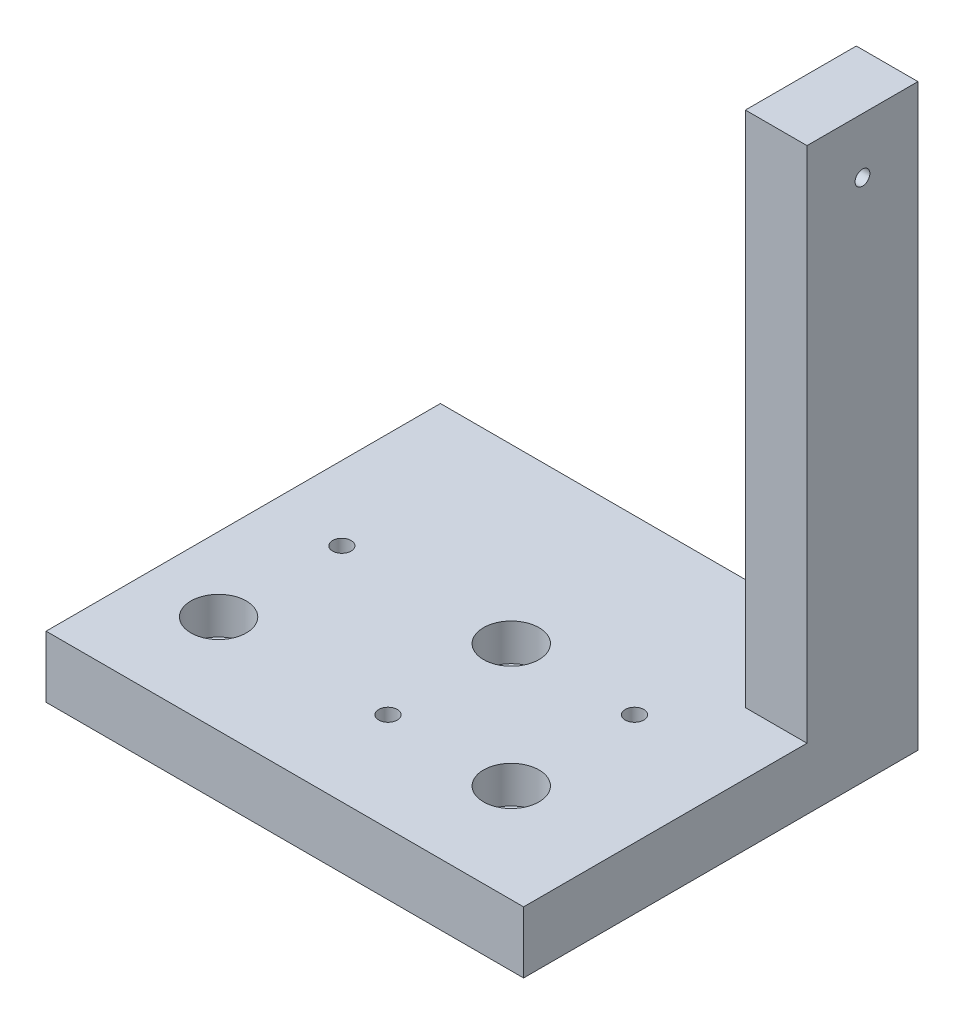
ISO-10303-21;
HEADER;
FILE_DESCRIPTION(('STEP AP214'),'2;1');
FILE_NAME('part.step','',(''),(''),'','','');
FILE_SCHEMA(('AUTOMOTIVE_DESIGN { 1 0 10303 214 1 1 1 1 }'));
ENDSEC;
DATA;
#1=APPLICATION_CONTEXT('core data for automotive mechanical design processes');
#2=APPLICATION_PROTOCOL_DEFINITION('international standard','automotive_design',2000,#1);
#3=PRODUCT_CONTEXT('',#1,'mechanical');
#4=PRODUCT('Part','Part','',(#3));
#5=PRODUCT_RELATED_PRODUCT_CATEGORY('part','',(#4));
#6=PRODUCT_DEFINITION_FORMATION('','',#4);
#7=PRODUCT_DEFINITION_CONTEXT('part definition',#1,'design');
#8=PRODUCT_DEFINITION('design','',#6,#7);
#9=PRODUCT_DEFINITION_SHAPE('','',#8);
#10=(LENGTH_UNIT() NAMED_UNIT(*) SI_UNIT(.MILLI.,.METRE.));
#11=(NAMED_UNIT(*) PLANE_ANGLE_UNIT() SI_UNIT($,.RADIAN.));
#12=(NAMED_UNIT(*) SI_UNIT($,.STERADIAN.) SOLID_ANGLE_UNIT());
#13=UNCERTAINTY_MEASURE_WITH_UNIT(LENGTH_MEASURE(1.E-05),#10,'distance_accuracy_value','');
#14=(GEOMETRIC_REPRESENTATION_CONTEXT(3) GLOBAL_UNCERTAINTY_ASSIGNED_CONTEXT((#13)) GLOBAL_UNIT_ASSIGNED_CONTEXT((#10,
#11,#12)) REPRESENTATION_CONTEXT('',''));
#15=CARTESIAN_POINT('',(0.,0.,0.));
#16=DIRECTION('',(0.,0.,1.));
#17=DIRECTION('',(1.,0.,0.));
#18=AXIS2_PLACEMENT_3D('',#15,#16,#17);
#19=CARTESIAN_POINT('',(0.,5.,0.));
#20=DIRECTION('',(0.,1.,0.));
#21=DIRECTION('',(0.,0.,1.));
#22=AXIS2_PLACEMENT_3D('',#19,#20,#21);
#23=PLANE('',#22);
#24=CARTESIAN_POINT('',(-32.75,5.,-8.));
#25=DIRECTION('',(0.,1.,0.));
#26=DIRECTION('',(0.,0.,1.));
#27=AXIS2_PLACEMENT_3D('',#24,#25,#26);
#28=CIRCLE('',#27,2.25);
#29=CARTESIAN_POINT('',(-32.75,5.,-5.75));
#30=VERTEX_POINT('',#29);
#31=EDGE_CURVE('E164',#30,#30,#28,.T.);
#32=ORIENTED_EDGE('',*,*,#31,.F.);
#33=EDGE_LOOP('',(#32));
#34=FACE_BOUND('',#33,.T.);
#35=CARTESIAN_POINT('',(-19.,5.,-18.));
#36=DIRECTION('',(0.,1.,0.));
#37=DIRECTION('',(0.,0.,1.));
#38=AXIS2_PLACEMENT_3D('',#35,#36,#37);
#39=CIRCLE('',#38,2.25);
#40=CARTESIAN_POINT('',(-19.,5.,-15.75));
#41=VERTEX_POINT('',#40);
#42=EDGE_CURVE('E168',#41,#41,#39,.T.);
#43=ORIENTED_EDGE('',*,*,#42,.F.);
#44=EDGE_LOOP('',(#43));
#45=FACE_BOUND('',#44,.T.);
#46=CARTESIAN_POINT('',(-9.,5.,-8.));
#47=DIRECTION('',(0.,1.,0.));
#48=DIRECTION('',(0.,0.,1.));
#49=AXIS2_PLACEMENT_3D('',#46,#47,#48);
#50=CIRCLE('',#49,2.25);
#51=CARTESIAN_POINT('',(-9.,5.,-5.75));
#52=VERTEX_POINT('',#51);
#53=EDGE_CURVE('E175',#52,#52,#50,.T.);
#54=ORIENTED_EDGE('',*,*,#53,.F.);
#55=EDGE_LOOP('',(#54));
#56=FACE_BOUND('',#55,.T.);
#57=CARTESIAN_POINT('',(-19.,5.,-8.));
#58=DIRECTION('',(0.,1.,0.));
#59=DIRECTION('',(0.,0.,1.));
#60=AXIS2_PLACEMENT_3D('',#57,#58,#59);
#61=CIRCLE('',#60,0.750000000000002);
#62=CARTESIAN_POINT('',(-19.,5.,-7.25));
#63=VERTEX_POINT('',#62);
#64=EDGE_CURVE('E196',#63,#63,#61,.T.);
#65=ORIENTED_EDGE('',*,*,#64,.F.);
#66=EDGE_LOOP('',(#65));
#67=FACE_BOUND('',#66,.T.);
#68=CARTESIAN_POINT('',(-32.75,5.,-18.));
#69=DIRECTION('',(0.,1.,0.));
#70=DIRECTION('',(0.,0.,1.));
#71=AXIS2_PLACEMENT_3D('',#68,#69,#70);
#72=CIRCLE('',#71,0.749999999999999);
#73=CARTESIAN_POINT('',(-32.75,5.,-17.25));
#74=VERTEX_POINT('',#73);
#75=EDGE_CURVE('E189',#74,#74,#72,.T.);
#76=ORIENTED_EDGE('',*,*,#75,.F.);
#77=EDGE_LOOP('',(#76));
#78=FACE_BOUND('',#77,.T.);
#79=CARTESIAN_POINT('',(-9.,5.,-18.));
#80=DIRECTION('',(0.,1.,0.));
#81=DIRECTION('',(0.,0.,1.));
#82=AXIS2_PLACEMENT_3D('',#79,#80,#81);
#83=CIRCLE('',#82,0.75);
#84=CARTESIAN_POINT('',(-9.,5.,-17.25));
#85=VERTEX_POINT('',#84);
#86=EDGE_CURVE('E182',#85,#85,#83,.T.);
#87=ORIENTED_EDGE('',*,*,#86,.F.);
#88=EDGE_LOOP('',(#87));
#89=FACE_BOUND('',#88,.T.);
#90=DIRECTION('',(-1.,0.,0.));
#91=VECTOR('',#90,1.);
#92=CARTESIAN_POINT('',(0.,5.,-23.));
#93=LINE('',#92,#91);
#94=CARTESIAN_POINT('',(0.,5.,-23.));
#95=VERTEX_POINT('',#94);
#96=CARTESIAN_POINT('',(-5.,5.,-23.));
#97=VERTEX_POINT('',#96);
#98=EDGE_CURVE('E127',#95,#97,#93,.T.);
#99=ORIENTED_EDGE('',*,*,#98,.T.);
#100=DIRECTION('',(0.,0.,-1.));
#101=VECTOR('',#100,1.);
#102=CARTESIAN_POINT('',(-5.,5.,0.));
#103=LINE('',#102,#101);
#104=CARTESIAN_POINT('',(-5.,5.,-32.));
#105=VERTEX_POINT('',#104);
#106=EDGE_CURVE('E80',#97,#105,#103,.T.);
#107=ORIENTED_EDGE('',*,*,#106,.T.);
#108=DIRECTION('',(-1.,0.,0.));
#109=VECTOR('',#108,1.);
#110=CARTESIAN_POINT('',(0.,5.,-32.));
#111=LINE('',#110,#109);
#112=CARTESIAN_POINT('',(-38.75,5.,-32.));
#113=VERTEX_POINT('',#112);
#114=EDGE_CURVE('E125',#105,#113,#111,.T.);
#115=ORIENTED_EDGE('',*,*,#114,.T.);
#116=DIRECTION('',(0.,0.,-1.));
#117=VECTOR('',#116,1.);
#118=CARTESIAN_POINT('',(-38.75,5.,0.));
#119=LINE('',#118,#117);
#120=CARTESIAN_POINT('',(-38.75,5.,0.));
#121=VERTEX_POINT('',#120);
#122=EDGE_CURVE('E218',#121,#113,#119,.T.);
#123=ORIENTED_EDGE('',*,*,#122,.F.);
#124=DIRECTION('',(-1.,0.,0.));
#125=VECTOR('',#124,1.);
#126=CARTESIAN_POINT('',(0.,5.,0.));
#127=LINE('',#126,#125);
#128=CARTESIAN_POINT('',(0.,5.,0.));
#129=VERTEX_POINT('',#128);
#130=EDGE_CURVE('E221',#129,#121,#127,.T.);
#131=ORIENTED_EDGE('',*,*,#130,.F.);
#132=DIRECTION('',(0.,0.,-1.));
#133=VECTOR('',#132,1.);
#134=CARTESIAN_POINT('',(0.,5.,0.));
#135=LINE('',#134,#133);
#136=EDGE_CURVE('E87',#129,#95,#135,.T.);
#137=ORIENTED_EDGE('',*,*,#136,.T.);
#138=EDGE_LOOP('',(#99,#107,#115,#123,#131,#137));
#139=FACE_BOUND('',#138,.T.);
#140=ADVANCED_FACE('F63',(#34,#45,#56,#67,#78,#89,#139),#23,.T.);
#141=CARTESIAN_POINT('',(-32.75,0.,-8.));
#142=DIRECTION('',(0.,1.,0.));
#143=DIRECTION('',(0.,0.,1.));
#144=AXIS2_PLACEMENT_3D('',#141,#142,#143);
#145=CYLINDRICAL_SURFACE('',#144,1.5);
#146=CARTESIAN_POINT('',(-32.75,0.,-8.));
#147=DIRECTION('',(0.,1.,0.));
#148=DIRECTION('',(0.,0.,1.));
#149=AXIS2_PLACEMENT_3D('',#146,#147,#148);
#150=CIRCLE('',#149,1.5);
#151=CARTESIAN_POINT('',(-32.75,0.,-6.5));
#152=VERTEX_POINT('',#151);
#153=EDGE_CURVE('E204',#152,#152,#150,.T.);
#154=ORIENTED_EDGE('',*,*,#153,.F.);
#155=EDGE_LOOP('',(#154));
#156=FACE_BOUND('',#155,.T.);
#157=CARTESIAN_POINT('',(-32.75,2.,-8.));
#158=DIRECTION('',(0.,1.,0.));
#159=DIRECTION('',(0.,0.,1.));
#160=AXIS2_PLACEMENT_3D('',#157,#158,#159);
#161=CIRCLE('',#160,1.5);
#162=CARTESIAN_POINT('',(-32.75,2.,-6.5));
#163=VERTEX_POINT('',#162);
#164=EDGE_CURVE('E67',#163,#163,#161,.F.);
#165=ORIENTED_EDGE('',*,*,#164,.F.);
#166=EDGE_LOOP('',(#165));
#167=FACE_BOUND('',#166,.T.);
#168=ADVANCED_FACE('F240',(#156,#167),#145,.F.);
#169=CARTESIAN_POINT('',(-19.,0.,-18.));
#170=DIRECTION('',(0.,1.,0.));
#171=DIRECTION('',(0.,0.,1.));
#172=AXIS2_PLACEMENT_3D('',#169,#170,#171);
#173=CYLINDRICAL_SURFACE('',#172,1.5);
#174=CARTESIAN_POINT('',(-19.,0.,-18.));
#175=DIRECTION('',(0.,1.,0.));
#176=DIRECTION('',(0.,0.,1.));
#177=AXIS2_PLACEMENT_3D('',#174,#175,#176);
#178=CIRCLE('',#177,1.5);
#179=CARTESIAN_POINT('',(-19.,0.,-16.5));
#180=VERTEX_POINT('',#179);
#181=EDGE_CURVE('E201',#180,#180,#178,.T.);
#182=ORIENTED_EDGE('',*,*,#181,.F.);
#183=EDGE_LOOP('',(#182));
#184=FACE_BOUND('',#183,.T.);
#185=CARTESIAN_POINT('',(-19.,2.,-18.));
#186=DIRECTION('',(0.,1.,0.));
#187=DIRECTION('',(0.,0.,1.));
#188=AXIS2_PLACEMENT_3D('',#185,#186,#187);
#189=CIRCLE('',#188,1.5);
#190=CARTESIAN_POINT('',(-19.,2.,-16.5));
#191=VERTEX_POINT('',#190);
#192=EDGE_CURVE('E231',#191,#191,#189,.F.);
#193=ORIENTED_EDGE('',*,*,#192,.F.);
#194=EDGE_LOOP('',(#193));
#195=FACE_BOUND('',#194,.T.);
#196=ADVANCED_FACE('F242',(#184,#195),#173,.F.);
#197=CARTESIAN_POINT('',(-9.,0.,-8.));
#198=DIRECTION('',(0.,1.,0.));
#199=DIRECTION('',(0.,0.,1.));
#200=AXIS2_PLACEMENT_3D('',#197,#198,#199);
#201=CYLINDRICAL_SURFACE('',#200,1.5);
#202=CARTESIAN_POINT('',(-9.,0.,-8.));
#203=DIRECTION('',(0.,1.,0.));
#204=DIRECTION('',(0.,0.,1.));
#205=AXIS2_PLACEMENT_3D('',#202,#203,#204);
#206=CIRCLE('',#205,1.5);
#207=CARTESIAN_POINT('',(-9.,0.,-6.5));
#208=VERTEX_POINT('',#207);
#209=EDGE_CURVE('E192',#208,#208,#206,.T.);
#210=ORIENTED_EDGE('',*,*,#209,.F.);
#211=EDGE_LOOP('',(#210));
#212=FACE_BOUND('',#211,.T.);
#213=CARTESIAN_POINT('',(-9.,2.,-8.));
#214=DIRECTION('',(0.,1.,0.));
#215=DIRECTION('',(0.,0.,1.));
#216=AXIS2_PLACEMENT_3D('',#213,#214,#215);
#217=CIRCLE('',#216,1.5);
#218=CARTESIAN_POINT('',(-9.,2.,-6.5));
#219=VERTEX_POINT('',#218);
#220=EDGE_CURVE('E171',#219,#219,#217,.F.);
#221=ORIENTED_EDGE('',*,*,#220,.F.);
#222=EDGE_LOOP('',(#221));
#223=FACE_BOUND('',#222,.T.);
#224=ADVANCED_FACE('F249',(#212,#223),#201,.F.);
#225=CARTESIAN_POINT('',(0.,5.,0.));
#226=DIRECTION('',(-1.,0.,0.));
#227=DIRECTION('',(0.,0.,1.));
#228=AXIS2_PLACEMENT_3D('',#225,#226,#227);
#229=PLANE('',#228);
#230=CARTESIAN_POINT('',(0.,42.5,-27.5));
#231=DIRECTION('',(-1.,0.,0.));
#232=DIRECTION('',(0.,0.,1.));
#233=AXIS2_PLACEMENT_3D('',#230,#231,#232);
#234=CIRCLE('',#233,0.600000000000001);
#235=CARTESIAN_POINT('',(0.,42.5,-26.9));
#236=VERTEX_POINT('',#235);
#237=EDGE_CURVE('E210',#236,#236,#234,.T.);
#238=ORIENTED_EDGE('',*,*,#237,.T.);
#239=EDGE_LOOP('',(#238));
#240=FACE_BOUND('',#239,.T.);
#241=DIRECTION('',(0.,0.,-1.));
#242=VECTOR('',#241,1.);
#243=CARTESIAN_POINT('',(0.,0.,0.));
#244=LINE('',#243,#242);
#245=CARTESIAN_POINT('',(0.,0.,0.));
#246=VERTEX_POINT('',#245);
#247=CARTESIAN_POINT('',(0.,0.,-32.));
#248=VERTEX_POINT('',#247);
#249=EDGE_CURVE('E129',#246,#248,#244,.T.);
#250=ORIENTED_EDGE('',*,*,#249,.T.);
#251=DIRECTION('',(0.,-1.,0.));
#252=VECTOR('',#251,1.);
#253=CARTESIAN_POINT('',(0.,5.,-32.));
#254=LINE('',#253,#252);
#255=CARTESIAN_POINT('',(0.,47.,-32.));
#256=VERTEX_POINT('',#255);
#257=EDGE_CURVE('E142',#256,#248,#254,.T.);
#258=ORIENTED_EDGE('',*,*,#257,.F.);
#259=DIRECTION('',(0.,0.,1.));
#260=VECTOR('',#259,1.);
#261=CARTESIAN_POINT('',(0.,47.,-30.));
#262=LINE('',#261,#260);
#263=CARTESIAN_POINT('',(0.,47.,-23.));
#264=VERTEX_POINT('',#263);
#265=EDGE_CURVE('E130',#256,#264,#262,.T.);
#266=ORIENTED_EDGE('',*,*,#265,.T.);
#267=DIRECTION('',(0.,-1.,0.));
#268=VECTOR('',#267,1.);
#269=CARTESIAN_POINT('',(0.,47.,-23.));
#270=LINE('',#269,#268);
#271=EDGE_CURVE('E160',#264,#95,#270,.T.);
#272=ORIENTED_EDGE('',*,*,#271,.T.);
#273=ORIENTED_EDGE('',*,*,#136,.F.);
#274=DIRECTION('',(0.,-1.,0.));
#275=VECTOR('',#274,1.);
#276=CARTESIAN_POINT('',(0.,5.,0.));
#277=LINE('',#276,#275);
#278=EDGE_CURVE('E72',#129,#246,#277,.T.);
#279=ORIENTED_EDGE('',*,*,#278,.T.);
#280=EDGE_LOOP('',(#250,#258,#266,#272,#273,#279));
#281=FACE_BOUND('',#280,.T.);
#282=ADVANCED_FACE('F65',(#240,#281),#229,.F.);
#283=CARTESIAN_POINT('',(-38.75,5.,0.));
#284=DIRECTION('',(-1.,0.,0.));
#285=DIRECTION('',(0.,0.,1.));
#286=AXIS2_PLACEMENT_3D('',#283,#284,#285);
#287=PLANE('',#286);
#288=DIRECTION('',(0.,0.,-1.));
#289=VECTOR('',#288,1.);
#290=CARTESIAN_POINT('',(-38.75,0.,0.));
#291=LINE('',#290,#289);
#292=CARTESIAN_POINT('',(-38.75,0.,0.));
#293=VERTEX_POINT('',#292);
#294=CARTESIAN_POINT('',(-38.75,0.,-32.));
#295=VERTEX_POINT('',#294);
#296=EDGE_CURVE('E225',#293,#295,#291,.T.);
#297=ORIENTED_EDGE('',*,*,#296,.F.);
#298=DIRECTION('',(0.,-1.,0.));
#299=VECTOR('',#298,1.);
#300=CARTESIAN_POINT('',(-38.75,5.,0.));
#301=LINE('',#300,#299);
#302=EDGE_CURVE('E13',#121,#293,#301,.T.);
#303=ORIENTED_EDGE('',*,*,#302,.F.);
#304=ORIENTED_EDGE('',*,*,#122,.T.);
#305=DIRECTION('',(0.,-1.,0.));
#306=VECTOR('',#305,1.);
#307=CARTESIAN_POINT('',(-38.75,5.,-32.));
#308=LINE('',#307,#306);
#309=EDGE_CURVE('E141',#113,#295,#308,.T.);
#310=ORIENTED_EDGE('',*,*,#309,.T.);
#311=EDGE_LOOP('',(#297,#303,#304,#310));
#312=FACE_BOUND('',#311,.T.);
#313=ADVANCED_FACE('F275',(#312),#287,.T.);
#314=CARTESIAN_POINT('',(0.,5.,0.));
#315=DIRECTION('',(0.,0.,1.));
#316=DIRECTION('',(1.,0.,0.));
#317=AXIS2_PLACEMENT_3D('',#314,#315,#316);
#318=PLANE('',#317);
#319=DIRECTION('',(-1.,0.,0.));
#320=VECTOR('',#319,1.);
#321=CARTESIAN_POINT('',(0.,0.,0.));
#322=LINE('',#321,#320);
#323=EDGE_CURVE('E219',#246,#293,#322,.T.);
#324=ORIENTED_EDGE('',*,*,#323,.F.);
#325=ORIENTED_EDGE('',*,*,#278,.F.);
#326=ORIENTED_EDGE('',*,*,#130,.T.);
#327=ORIENTED_EDGE('',*,*,#302,.T.);
#328=EDGE_LOOP('',(#324,#325,#326,#327));
#329=FACE_BOUND('',#328,.T.);
#330=ADVANCED_FACE('F272',(#329),#318,.T.);
#331=CARTESIAN_POINT('',(0.,0.,0.));
#332=DIRECTION('',(0.,1.,0.));
#333=DIRECTION('',(0.,0.,1.));
#334=AXIS2_PLACEMENT_3D('',#331,#332,#333);
#335=PLANE('',#334);
#336=CARTESIAN_POINT('',(-19.,0.,-8.));
#337=DIRECTION('',(0.,1.,0.));
#338=DIRECTION('',(0.,0.,1.));
#339=AXIS2_PLACEMENT_3D('',#336,#337,#338);
#340=CIRCLE('',#339,0.750000000000002);
#341=CARTESIAN_POINT('',(-19.,0.,-7.25));
#342=VERTEX_POINT('',#341);
#343=EDGE_CURVE('E185',#342,#342,#340,.T.);
#344=ORIENTED_EDGE('',*,*,#343,.T.);
#345=EDGE_LOOP('',(#344));
#346=FACE_BOUND('',#345,.T.);
#347=CARTESIAN_POINT('',(-32.75,0.,-18.));
#348=DIRECTION('',(0.,1.,0.));
#349=DIRECTION('',(0.,0.,1.));
#350=AXIS2_PLACEMENT_3D('',#347,#348,#349);
#351=CIRCLE('',#350,0.749999999999999);
#352=CARTESIAN_POINT('',(-32.75,0.,-17.25));
#353=VERTEX_POINT('',#352);
#354=EDGE_CURVE('E193',#353,#353,#351,.T.);
#355=ORIENTED_EDGE('',*,*,#354,.T.);
#356=EDGE_LOOP('',(#355));
#357=FACE_BOUND('',#356,.T.);
#358=ORIENTED_EDGE('',*,*,#209,.T.);
#359=EDGE_LOOP('',(#358));
#360=FACE_BOUND('',#359,.T.);
#361=ORIENTED_EDGE('',*,*,#181,.T.);
#362=EDGE_LOOP('',(#361));
#363=FACE_BOUND('',#362,.T.);
#364=CARTESIAN_POINT('',(-9.,0.,-18.));
#365=DIRECTION('',(0.,1.,0.));
#366=DIRECTION('',(0.,0.,1.));
#367=AXIS2_PLACEMENT_3D('',#364,#365,#366);
#368=CIRCLE('',#367,0.75);
#369=CARTESIAN_POINT('',(-9.,0.,-17.25));
#370=VERTEX_POINT('',#369);
#371=EDGE_CURVE('E186',#370,#370,#368,.T.);
#372=ORIENTED_EDGE('',*,*,#371,.T.);
#373=EDGE_LOOP('',(#372));
#374=FACE_BOUND('',#373,.T.);
#375=ORIENTED_EDGE('',*,*,#153,.T.);
#376=EDGE_LOOP('',(#375));
#377=FACE_BOUND('',#376,.T.);
#378=ORIENTED_EDGE('',*,*,#296,.T.);
#379=DIRECTION('',(-1.,0.,0.));
#380=VECTOR('',#379,1.);
#381=CARTESIAN_POINT('',(0.,0.,-32.));
#382=LINE('',#381,#380);
#383=EDGE_CURVE('E143',#248,#295,#382,.T.);
#384=ORIENTED_EDGE('',*,*,#383,.F.);
#385=ORIENTED_EDGE('',*,*,#249,.F.);
#386=ORIENTED_EDGE('',*,*,#323,.T.);
#387=EDGE_LOOP('',(#378,#384,#385,#386));
#388=FACE_BOUND('',#387,.T.);
#389=ADVANCED_FACE('F267',(#346,#357,#360,#363,#374,#377,#388),#335,.F.);
#390=CARTESIAN_POINT('',(-5.,47.,-30.));
#391=DIRECTION('',(1.,0.,0.));
#392=DIRECTION('',(0.,0.,-1.));
#393=AXIS2_PLACEMENT_3D('',#390,#391,#392);
#394=PLANE('',#393);
#395=CARTESIAN_POINT('',(-5.,42.5,-27.5));
#396=DIRECTION('',(-1.,0.,0.));
#397=DIRECTION('',(0.,0.,1.));
#398=AXIS2_PLACEMENT_3D('',#395,#396,#397);
#399=CIRCLE('',#398,0.600000000000001);
#400=CARTESIAN_POINT('',(-5.,42.5,-26.9));
#401=VERTEX_POINT('',#400);
#402=EDGE_CURVE('E209',#401,#401,#399,.T.);
#403=ORIENTED_EDGE('',*,*,#402,.F.);
#404=EDGE_LOOP('',(#403));
#405=FACE_BOUND('',#404,.T.);
#406=ORIENTED_EDGE('',*,*,#106,.F.);
#407=DIRECTION('',(0.,-1.,0.));
#408=VECTOR('',#407,1.);
#409=CARTESIAN_POINT('',(-5.,47.,-23.));
#410=LINE('',#409,#408);
#411=CARTESIAN_POINT('',(-5.,47.,-23.));
#412=VERTEX_POINT('',#411);
#413=EDGE_CURVE('E157',#412,#97,#410,.T.);
#414=ORIENTED_EDGE('',*,*,#413,.F.);
#415=DIRECTION('',(0.,0.,1.));
#416=VECTOR('',#415,1.);
#417=CARTESIAN_POINT('',(-5.,47.,-30.));
#418=LINE('',#417,#416);
#419=CARTESIAN_POINT('',(-5.,47.,-32.));
#420=VERTEX_POINT('',#419);
#421=EDGE_CURVE('E146',#420,#412,#418,.T.);
#422=ORIENTED_EDGE('',*,*,#421,.F.);
#423=DIRECTION('',(0.,-1.,0.));
#424=VECTOR('',#423,1.);
#425=CARTESIAN_POINT('',(-5.,5.,-32.));
#426=LINE('',#425,#424);
#427=EDGE_CURVE('E137',#420,#105,#426,.T.);
#428=ORIENTED_EDGE('',*,*,#427,.T.);
#429=EDGE_LOOP('',(#406,#414,#422,#428));
#430=FACE_BOUND('',#429,.T.);
#431=ADVANCED_FACE('F145',(#405,#430),#394,.F.);
#432=CARTESIAN_POINT('',(0.,47.,0.));
#433=DIRECTION('',(0.,1.,0.));
#434=DIRECTION('',(0.,0.,1.));
#435=AXIS2_PLACEMENT_3D('',#432,#433,#434);
#436=PLANE('',#435);
#437=ORIENTED_EDGE('',*,*,#265,.F.);
#438=DIRECTION('',(-1.,0.,0.));
#439=VECTOR('',#438,1.);
#440=CARTESIAN_POINT('',(0.,47.,-32.));
#441=LINE('',#440,#439);
#442=EDGE_CURVE('E147',#256,#420,#441,.T.);
#443=ORIENTED_EDGE('',*,*,#442,.T.);
#444=ORIENTED_EDGE('',*,*,#421,.T.);
#445=DIRECTION('',(-1.,0.,0.));
#446=VECTOR('',#445,1.);
#447=CARTESIAN_POINT('',(0.,47.,-23.));
#448=LINE('',#447,#446);
#449=EDGE_CURVE('E149',#264,#412,#448,.T.);
#450=ORIENTED_EDGE('',*,*,#449,.F.);
#451=EDGE_LOOP('',(#437,#443,#444,#450));
#452=FACE_BOUND('',#451,.T.);
#453=ADVANCED_FACE('F261',(#452),#436,.T.);
#454=CARTESIAN_POINT('',(0.,42.5,-27.5));
#455=DIRECTION('',(-1.,0.,0.));
#456=DIRECTION('',(0.,0.,1.));
#457=AXIS2_PLACEMENT_3D('',#454,#455,#456);
#458=CYLINDRICAL_SURFACE('',#457,0.600000000000001);
#459=ORIENTED_EDGE('',*,*,#237,.F.);
#460=EDGE_LOOP('',(#459));
#461=FACE_BOUND('',#460,.T.);
#462=ORIENTED_EDGE('',*,*,#402,.T.);
#463=EDGE_LOOP('',(#462));
#464=FACE_BOUND('',#463,.T.);
#465=ADVANCED_FACE('F257',(#461,#464),#458,.F.);
#466=CARTESIAN_POINT('',(-9.,0.,-18.));
#467=DIRECTION('',(0.,1.,0.));
#468=DIRECTION('',(0.,0.,1.));
#469=AXIS2_PLACEMENT_3D('',#466,#467,#468);
#470=CYLINDRICAL_SURFACE('',#469,0.75);
#471=ORIENTED_EDGE('',*,*,#371,.F.);
#472=EDGE_LOOP('',(#471));
#473=FACE_BOUND('',#472,.T.);
#474=ORIENTED_EDGE('',*,*,#86,.T.);
#475=EDGE_LOOP('',(#474));
#476=FACE_BOUND('',#475,.T.);
#477=ADVANCED_FACE('F260',(#473,#476),#470,.F.);
#478=CARTESIAN_POINT('',(-32.75,0.,-18.));
#479=DIRECTION('',(0.,1.,0.));
#480=DIRECTION('',(0.,0.,1.));
#481=AXIS2_PLACEMENT_3D('',#478,#479,#480);
#482=CYLINDRICAL_SURFACE('',#481,0.749999999999999);
#483=ORIENTED_EDGE('',*,*,#354,.F.);
#484=EDGE_LOOP('',(#483));
#485=FACE_BOUND('',#484,.T.);
#486=ORIENTED_EDGE('',*,*,#75,.T.);
#487=EDGE_LOOP('',(#486));
#488=FACE_BOUND('',#487,.T.);
#489=ADVANCED_FACE('F327',(#485,#488),#482,.F.);
#490=CARTESIAN_POINT('',(-19.,0.,-8.));
#491=DIRECTION('',(0.,1.,0.));
#492=DIRECTION('',(0.,0.,1.));
#493=AXIS2_PLACEMENT_3D('',#490,#491,#492);
#494=CYLINDRICAL_SURFACE('',#493,0.750000000000002);
#495=ORIENTED_EDGE('',*,*,#343,.F.);
#496=EDGE_LOOP('',(#495));
#497=FACE_BOUND('',#496,.T.);
#498=ORIENTED_EDGE('',*,*,#64,.T.);
#499=EDGE_LOOP('',(#498));
#500=FACE_BOUND('',#499,.T.);
#501=ADVANCED_FACE('F323',(#497,#500),#494,.F.);
#502=CARTESIAN_POINT('',(0.,2.,0.));
#503=DIRECTION('',(0.,1.,0.));
#504=DIRECTION('',(0.,0.,1.));
#505=AXIS2_PLACEMENT_3D('',#502,#503,#504);
#506=PLANE('',#505);
#507=CARTESIAN_POINT('',(-9.,2.,-8.));
#508=DIRECTION('',(0.,1.,0.));
#509=DIRECTION('',(0.,0.,1.));
#510=AXIS2_PLACEMENT_3D('',#507,#508,#509);
#511=CIRCLE('',#510,2.25);
#512=CARTESIAN_POINT('',(-9.,2.,-5.75));
#513=VERTEX_POINT('',#512);
#514=EDGE_CURVE('E163',#513,#513,#511,.F.);
#515=ORIENTED_EDGE('',*,*,#514,.F.);
#516=EDGE_LOOP('',(#515));
#517=FACE_BOUND('',#516,.T.);
#518=ORIENTED_EDGE('',*,*,#220,.T.);
#519=EDGE_LOOP('',(#518));
#520=FACE_BOUND('',#519,.T.);
#521=ADVANCED_FACE('F319',(#517,#520),#506,.T.);
#522=CARTESIAN_POINT('',(-9.,-6.36396103067893,-8.));
#523=DIRECTION('',(0.,1.,0.));
#524=DIRECTION('',(0.,0.,1.));
#525=AXIS2_PLACEMENT_3D('',#522,#523,#524);
#526=CYLINDRICAL_SURFACE('',#525,2.25);
#527=ORIENTED_EDGE('',*,*,#514,.T.);
#528=EDGE_LOOP('',(#527));
#529=FACE_BOUND('',#528,.T.);
#530=ORIENTED_EDGE('',*,*,#53,.T.);
#531=EDGE_LOOP('',(#530));
#532=FACE_BOUND('',#531,.T.);
#533=ADVANCED_FACE('F315',(#529,#532),#526,.F.);
#534=CARTESIAN_POINT('',(0.,2.,0.));
#535=DIRECTION('',(0.,1.,0.));
#536=DIRECTION('',(0.,0.,1.));
#537=AXIS2_PLACEMENT_3D('',#534,#535,#536);
#538=PLANE('',#537);
#539=CARTESIAN_POINT('',(-19.,2.,-18.));
#540=DIRECTION('',(0.,1.,0.));
#541=DIRECTION('',(0.,0.,1.));
#542=AXIS2_PLACEMENT_3D('',#539,#540,#541);
#543=CIRCLE('',#542,2.25);
#544=CARTESIAN_POINT('',(-19.,2.,-15.75));
#545=VERTEX_POINT('',#544);
#546=EDGE_CURVE('E172',#545,#545,#543,.F.);
#547=ORIENTED_EDGE('',*,*,#546,.F.);
#548=EDGE_LOOP('',(#547));
#549=FACE_BOUND('',#548,.T.);
#550=ORIENTED_EDGE('',*,*,#192,.T.);
#551=EDGE_LOOP('',(#550));
#552=FACE_BOUND('',#551,.T.);
#553=ADVANCED_FACE('F311',(#549,#552),#538,.T.);
#554=CARTESIAN_POINT('',(-19.,-6.36396103067893,-18.));
#555=DIRECTION('',(0.,1.,0.));
#556=DIRECTION('',(0.,0.,1.));
#557=AXIS2_PLACEMENT_3D('',#554,#555,#556);
#558=CYLINDRICAL_SURFACE('',#557,2.25);
#559=ORIENTED_EDGE('',*,*,#546,.T.);
#560=EDGE_LOOP('',(#559));
#561=FACE_BOUND('',#560,.T.);
#562=ORIENTED_EDGE('',*,*,#42,.T.);
#563=EDGE_LOOP('',(#562));
#564=FACE_BOUND('',#563,.T.);
#565=ADVANCED_FACE('F306',(#561,#564),#558,.F.);
#566=CARTESIAN_POINT('',(0.,2.,0.));
#567=DIRECTION('',(0.,1.,0.));
#568=DIRECTION('',(0.,0.,1.));
#569=AXIS2_PLACEMENT_3D('',#566,#567,#568);
#570=PLANE('',#569);
#571=CARTESIAN_POINT('',(-32.75,2.,-8.));
#572=DIRECTION('',(0.,1.,0.));
#573=DIRECTION('',(0.,0.,1.));
#574=AXIS2_PLACEMENT_3D('',#571,#572,#573);
#575=CIRCLE('',#574,2.25);
#576=CARTESIAN_POINT('',(-32.75,2.,-5.75));
#577=VERTEX_POINT('',#576);
#578=EDGE_CURVE('E167',#577,#577,#575,.F.);
#579=ORIENTED_EDGE('',*,*,#578,.F.);
#580=EDGE_LOOP('',(#579));
#581=FACE_BOUND('',#580,.T.);
#582=ORIENTED_EDGE('',*,*,#164,.T.);
#583=EDGE_LOOP('',(#582));
#584=FACE_BOUND('',#583,.T.);
#585=ADVANCED_FACE('F238',(#581,#584),#570,.T.);
#586=CARTESIAN_POINT('',(-32.75,-6.36396103067893,-8.));
#587=DIRECTION('',(0.,1.,0.));
#588=DIRECTION('',(0.,0.,1.));
#589=AXIS2_PLACEMENT_3D('',#586,#587,#588);
#590=CYLINDRICAL_SURFACE('',#589,2.25);
#591=ORIENTED_EDGE('',*,*,#578,.T.);
#592=EDGE_LOOP('',(#591));
#593=FACE_BOUND('',#592,.T.);
#594=ORIENTED_EDGE('',*,*,#31,.T.);
#595=EDGE_LOOP('',(#594));
#596=FACE_BOUND('',#595,.T.);
#597=ADVANCED_FACE('F295',(#593,#596),#590,.F.);
#598=CARTESIAN_POINT('',(0.,0.,-23.));
#599=DIRECTION('',(0.,0.,1.));
#600=DIRECTION('',(1.,0.,0.));
#601=AXIS2_PLACEMENT_3D('',#598,#599,#600);
#602=PLANE('',#601);
#603=ORIENTED_EDGE('',*,*,#449,.T.);
#604=ORIENTED_EDGE('',*,*,#413,.T.);
#605=ORIENTED_EDGE('',*,*,#98,.F.);
#606=ORIENTED_EDGE('',*,*,#271,.F.);
#607=EDGE_LOOP('',(#603,#604,#605,#606));
#608=FACE_BOUND('',#607,.T.);
#609=ADVANCED_FACE('F293',(#608),#602,.T.);
#610=CARTESIAN_POINT('',(0.,0.,-32.));
#611=DIRECTION('',(0.,0.,-1.));
#612=DIRECTION('',(-1.,0.,0.));
#613=AXIS2_PLACEMENT_3D('',#610,#611,#612);
#614=PLANE('',#613);
#615=ORIENTED_EDGE('',*,*,#257,.T.);
#616=ORIENTED_EDGE('',*,*,#383,.T.);
#617=ORIENTED_EDGE('',*,*,#309,.F.);
#618=ORIENTED_EDGE('',*,*,#114,.F.);
#619=ORIENTED_EDGE('',*,*,#427,.F.);
#620=ORIENTED_EDGE('',*,*,#442,.F.);
#621=EDGE_LOOP('',(#615,#616,#617,#618,#619,#620));
#622=FACE_BOUND('',#621,.T.);
#623=ADVANCED_FACE('F135',(#622),#614,.T.);
#624=CLOSED_SHELL('',(#140,#168,#196,#224,#282,#313,#330,#389,#431,#453,#465,#477,#489,#501,
#521,#533,#553,#565,#585,#597,#609,#623));
#625=MANIFOLD_SOLID_BREP('B2',#624);
#626=ADVANCED_BREP_SHAPE_REPRESENTATION('',(#18,#625),#14);
#627=SHAPE_DEFINITION_REPRESENTATION(#9,#626);
ENDSEC;
END-ISO-10303-21;
